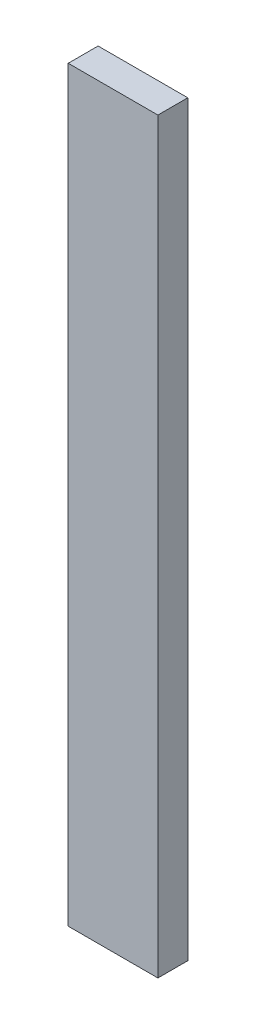
ISO-10303-21;
HEADER;
FILE_DESCRIPTION(('STEP AP214'),'2;1');
FILE_NAME('part.step','',(''),(''),'','','');
FILE_SCHEMA(('AUTOMOTIVE_DESIGN { 1 0 10303 214 1 1 1 1 }'));
ENDSEC;
DATA;
#1=APPLICATION_CONTEXT('core data for automotive mechanical design processes');
#2=APPLICATION_PROTOCOL_DEFINITION('international standard','automotive_design',2000,#1);
#3=PRODUCT_CONTEXT('',#1,'mechanical');
#4=PRODUCT('Part','Part','',(#3));
#5=PRODUCT_RELATED_PRODUCT_CATEGORY('part','',(#4));
#6=PRODUCT_DEFINITION_FORMATION('','',#4);
#7=PRODUCT_DEFINITION_CONTEXT('part definition',#1,'design');
#8=PRODUCT_DEFINITION('design','',#6,#7);
#9=PRODUCT_DEFINITION_SHAPE('','',#8);
#10=(LENGTH_UNIT() NAMED_UNIT(*) SI_UNIT(.MILLI.,.METRE.));
#11=(NAMED_UNIT(*) PLANE_ANGLE_UNIT() SI_UNIT($,.RADIAN.));
#12=(NAMED_UNIT(*) SI_UNIT($,.STERADIAN.) SOLID_ANGLE_UNIT());
#13=UNCERTAINTY_MEASURE_WITH_UNIT(LENGTH_MEASURE(1.E-05),#10,'distance_accuracy_value','');
#14=(GEOMETRIC_REPRESENTATION_CONTEXT(3) GLOBAL_UNCERTAINTY_ASSIGNED_CONTEXT((#13)) GLOBAL_UNIT_ASSIGNED_CONTEXT((#10,
#11,#12)) REPRESENTATION_CONTEXT('',''));
#15=CARTESIAN_POINT('',(0.,0.,0.));
#16=DIRECTION('',(0.,0.,1.));
#17=DIRECTION('',(1.,0.,0.));
#18=AXIS2_PLACEMENT_3D('',#15,#16,#17);
#19=CARTESIAN_POINT('',(0.,0.,1.));
#20=DIRECTION('',(0.,1.,0.));
#21=DIRECTION('',(0.,0.,1.));
#22=AXIS2_PLACEMENT_3D('',#19,#20,#21);
#23=PLANE('',#22);
#24=DIRECTION('',(1.,0.,0.));
#25=VECTOR('',#24,1.);
#26=CARTESIAN_POINT('',(0.,0.,0.));
#27=LINE('',#26,#25);
#28=CARTESIAN_POINT('',(-3.,0.,0.));
#29=VERTEX_POINT('',#28);
#30=CARTESIAN_POINT('',(0.,0.,0.));
#31=VERTEX_POINT('',#30);
#32=EDGE_CURVE('E113',#29,#31,#27,.T.);
#33=ORIENTED_EDGE('',*,*,#32,.T.);
#34=DIRECTION('',(0.,0.,-1.));
#35=VECTOR('',#34,1.);
#36=CARTESIAN_POINT('',(0.,0.,1.));
#37=LINE('',#36,#35);
#38=CARTESIAN_POINT('',(0.,0.,1.));
#39=VERTEX_POINT('',#38);
#40=EDGE_CURVE('E11',#39,#31,#37,.T.);
#41=ORIENTED_EDGE('',*,*,#40,.F.);
#42=DIRECTION('',(1.,0.,0.));
#43=VECTOR('',#42,1.);
#44=CARTESIAN_POINT('',(0.,0.,1.));
#45=LINE('',#44,#43);
#46=CARTESIAN_POINT('',(-3.,0.,1.));
#47=VERTEX_POINT('',#46);
#48=EDGE_CURVE('E97',#47,#39,#45,.T.);
#49=ORIENTED_EDGE('',*,*,#48,.F.);
#50=DIRECTION('',(0.,0.,-1.));
#51=VECTOR('',#50,1.);
#52=CARTESIAN_POINT('',(-3.,0.,1.));
#53=LINE('',#52,#51);
#54=EDGE_CURVE('E109',#47,#29,#53,.T.);
#55=ORIENTED_EDGE('',*,*,#54,.T.);
#56=EDGE_LOOP('',(#33,#41,#49,#55));
#57=FACE_BOUND('',#56,.T.);
#58=ADVANCED_FACE('F45',(#57),#23,.F.);
#59=CARTESIAN_POINT('',(0.,0.,1.));
#60=DIRECTION('',(-1.,0.,0.));
#61=DIRECTION('',(0.,0.,1.));
#62=AXIS2_PLACEMENT_3D('',#59,#60,#61);
#63=PLANE('',#62);
#64=DIRECTION('',(0.,1.,0.));
#65=VECTOR('',#64,1.);
#66=CARTESIAN_POINT('',(0.,0.,0.));
#67=LINE('',#66,#65);
#68=CARTESIAN_POINT('',(0.,25.,0.));
#69=VERTEX_POINT('',#68);
#70=EDGE_CURVE('E102',#31,#69,#67,.T.);
#71=ORIENTED_EDGE('',*,*,#70,.T.);
#72=DIRECTION('',(0.,0.,-1.));
#73=VECTOR('',#72,1.);
#74=CARTESIAN_POINT('',(0.,25.,1.));
#75=LINE('',#74,#73);
#76=CARTESIAN_POINT('',(0.,25.,1.));
#77=VERTEX_POINT('',#76);
#78=EDGE_CURVE('E54',#77,#69,#75,.T.);
#79=ORIENTED_EDGE('',*,*,#78,.F.);
#80=DIRECTION('',(0.,1.,0.));
#81=VECTOR('',#80,1.);
#82=CARTESIAN_POINT('',(0.,0.,1.));
#83=LINE('',#82,#81);
#84=EDGE_CURVE('E92',#39,#77,#83,.T.);
#85=ORIENTED_EDGE('',*,*,#84,.F.);
#86=ORIENTED_EDGE('',*,*,#40,.T.);
#87=EDGE_LOOP('',(#71,#79,#85,#86));
#88=FACE_BOUND('',#87,.T.);
#89=ADVANCED_FACE('F101',(#88),#63,.F.);
#90=CARTESIAN_POINT('',(0.,25.,1.));
#91=DIRECTION('',(0.,-1.,0.));
#92=DIRECTION('',(0.,0.,-1.));
#93=AXIS2_PLACEMENT_3D('',#90,#91,#92);
#94=PLANE('',#93);
#95=DIRECTION('',(-1.,0.,0.));
#96=VECTOR('',#95,1.);
#97=CARTESIAN_POINT('',(0.,25.,0.));
#98=LINE('',#97,#96);
#99=CARTESIAN_POINT('',(-3.,25.,0.));
#100=VERTEX_POINT('',#99);
#101=EDGE_CURVE('E79',#69,#100,#98,.T.);
#102=ORIENTED_EDGE('',*,*,#101,.T.);
#103=DIRECTION('',(0.,0.,-1.));
#104=VECTOR('',#103,1.);
#105=CARTESIAN_POINT('',(-3.,25.,1.));
#106=LINE('',#105,#104);
#107=CARTESIAN_POINT('',(-3.,25.,1.));
#108=VERTEX_POINT('',#107);
#109=EDGE_CURVE('E104',#108,#100,#106,.T.);
#110=ORIENTED_EDGE('',*,*,#109,.F.);
#111=DIRECTION('',(-1.,0.,0.));
#112=VECTOR('',#111,1.);
#113=CARTESIAN_POINT('',(0.,25.,1.));
#114=LINE('',#113,#112);
#115=EDGE_CURVE('E95',#77,#108,#114,.T.);
#116=ORIENTED_EDGE('',*,*,#115,.F.);
#117=ORIENTED_EDGE('',*,*,#78,.T.);
#118=EDGE_LOOP('',(#102,#110,#116,#117));
#119=FACE_BOUND('',#118,.T.);
#120=ADVANCED_FACE('F105',(#119),#94,.F.);
#121=CARTESIAN_POINT('',(-3.,0.,1.));
#122=DIRECTION('',(1.,0.,0.));
#123=DIRECTION('',(0.,0.,-1.));
#124=AXIS2_PLACEMENT_3D('',#121,#122,#123);
#125=PLANE('',#124);
#126=DIRECTION('',(0.,-1.,0.));
#127=VECTOR('',#126,1.);
#128=CARTESIAN_POINT('',(-3.,0.,0.));
#129=LINE('',#128,#127);
#130=EDGE_CURVE('E85',#100,#29,#129,.T.);
#131=ORIENTED_EDGE('',*,*,#130,.T.);
#132=ORIENTED_EDGE('',*,*,#54,.F.);
#133=DIRECTION('',(0.,-1.,0.));
#134=VECTOR('',#133,1.);
#135=CARTESIAN_POINT('',(-3.,0.,1.));
#136=LINE('',#135,#134);
#137=EDGE_CURVE('E62',#108,#47,#136,.T.);
#138=ORIENTED_EDGE('',*,*,#137,.F.);
#139=ORIENTED_EDGE('',*,*,#109,.T.);
#140=EDGE_LOOP('',(#131,#132,#138,#139));
#141=FACE_BOUND('',#140,.T.);
#142=ADVANCED_FACE('F126',(#141),#125,.F.);
#143=CARTESIAN_POINT('',(0.,0.,1.));
#144=DIRECTION('',(0.,0.,-1.));
#145=DIRECTION('',(-1.,0.,0.));
#146=AXIS2_PLACEMENT_3D('',#143,#144,#145);
#147=PLANE('',#146);
#148=ORIENTED_EDGE('',*,*,#48,.T.);
#149=ORIENTED_EDGE('',*,*,#84,.T.);
#150=ORIENTED_EDGE('',*,*,#115,.T.);
#151=ORIENTED_EDGE('',*,*,#137,.T.);
#152=EDGE_LOOP('',(#148,#149,#150,#151));
#153=FACE_BOUND('',#152,.T.);
#154=ADVANCED_FACE('F93',(#153),#147,.F.);
#155=CARTESIAN_POINT('',(0.,0.,0.));
#156=DIRECTION('',(0.,0.,-1.));
#157=DIRECTION('',(-1.,0.,0.));
#158=AXIS2_PLACEMENT_3D('',#155,#156,#157);
#159=PLANE('',#158);
#160=ORIENTED_EDGE('',*,*,#32,.F.);
#161=ORIENTED_EDGE('',*,*,#130,.F.);
#162=ORIENTED_EDGE('',*,*,#101,.F.);
#163=ORIENTED_EDGE('',*,*,#70,.F.);
#164=EDGE_LOOP('',(#160,#161,#162,#163));
#165=FACE_BOUND('',#164,.T.);
#166=ADVANCED_FACE('F129',(#165),#159,.T.);
#167=CLOSED_SHELL('',(#58,#89,#120,#142,#154,#166));
#168=MANIFOLD_SOLID_BREP('B2',#167);
#169=ADVANCED_BREP_SHAPE_REPRESENTATION('',(#18,#168),#14);
#170=SHAPE_DEFINITION_REPRESENTATION(#9,#169);
ENDSEC;
END-ISO-10303-21;
